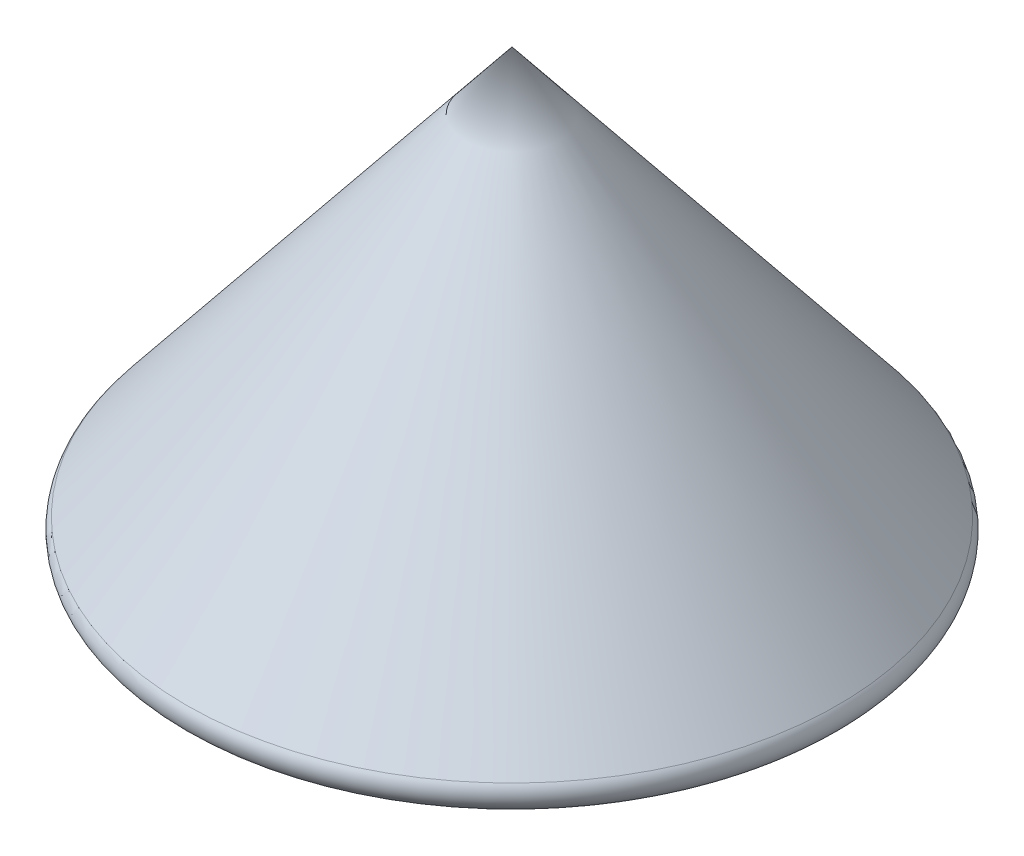
ISO-10303-21;
HEADER;
FILE_DESCRIPTION(('STEP AP214'),'2;1');
FILE_NAME('part.step','',(''),(''),'','','');
FILE_SCHEMA(('AUTOMOTIVE_DESIGN { 1 0 10303 214 1 1 1 1 }'));
ENDSEC;
DATA;
#1=APPLICATION_CONTEXT('core data for automotive mechanical design processes');
#2=APPLICATION_PROTOCOL_DEFINITION('international standard','automotive_design',2000,#1);
#3=PRODUCT_CONTEXT('',#1,'mechanical');
#4=PRODUCT('Part','Part','',(#3));
#5=PRODUCT_RELATED_PRODUCT_CATEGORY('part','',(#4));
#6=PRODUCT_DEFINITION_FORMATION('','',#4);
#7=PRODUCT_DEFINITION_CONTEXT('part definition',#1,'design');
#8=PRODUCT_DEFINITION('design','',#6,#7);
#9=PRODUCT_DEFINITION_SHAPE('','',#8);
#10=(LENGTH_UNIT() NAMED_UNIT(*) SI_UNIT(.MILLI.,.METRE.));
#11=(NAMED_UNIT(*) PLANE_ANGLE_UNIT() SI_UNIT($,.RADIAN.));
#12=(NAMED_UNIT(*) SI_UNIT($,.STERADIAN.) SOLID_ANGLE_UNIT());
#13=UNCERTAINTY_MEASURE_WITH_UNIT(LENGTH_MEASURE(1.E-05),#10,'distance_accuracy_value','');
#14=(GEOMETRIC_REPRESENTATION_CONTEXT(3) GLOBAL_UNCERTAINTY_ASSIGNED_CONTEXT((#13)) GLOBAL_UNIT_ASSIGNED_CONTEXT((#10,
#11,#12)) REPRESENTATION_CONTEXT('',''));
#15=CARTESIAN_POINT('',(0.,0.,0.));
#16=DIRECTION('',(0.,0.,1.));
#17=DIRECTION('',(1.,0.,0.));
#18=AXIS2_PLACEMENT_3D('',#15,#16,#17);
#19=CARTESIAN_POINT('',(0.,0.,0.));
#20=DIRECTION('',(0.,1.,0.));
#21=DIRECTION('',(0.,0.,1.));
#22=AXIS2_PLACEMENT_3D('',#19,#20,#21);
#23=PLANE('',#22);
#24=CARTESIAN_POINT('',(0.,0.,0.));
#25=DIRECTION('',(0.,1.,0.));
#26=DIRECTION('',(0.,0.,1.));
#27=AXIS2_PLACEMENT_3D('',#24,#25,#26);
#28=CIRCLE('',#27,17.9193751525134);
#29=CARTESIAN_POINT('',(0.,0.,17.9193751525134));
#30=VERTEX_POINT('',#29);
#31=EDGE_CURVE('E11',#30,#30,#28,.F.);
#32=ORIENTED_EDGE('',*,*,#31,.T.);
#33=EDGE_LOOP('',(#32));
#34=FACE_BOUND('',#33,.T.);
#35=CARTESIAN_POINT('',(0.,0.,0.));
#36=DIRECTION('',(0.,-1.,0.));
#37=DIRECTION('',(0.,0.,-1.));
#38=AXIS2_PLACEMENT_3D('',#35,#36,#37);
#39=CIRCLE('',#38,2.9);
#40=CARTESIAN_POINT('',(0.,0.,-2.9));
#41=VERTEX_POINT('',#40);
#42=EDGE_CURVE('E67',#41,#41,#39,.T.);
#43=ORIENTED_EDGE('',*,*,#42,.F.);
#44=EDGE_LOOP('',(#43));
#45=FACE_BOUND('',#44,.T.);
#46=ADVANCED_FACE('F33',(#34,#45),#23,.F.);
#47=CARTESIAN_POINT('',(0.,0.,0.));
#48=DIRECTION('',(0.,-1.,0.));
#49=DIRECTION('',(0.,0.,-1.));
#50=AXIS2_PLACEMENT_3D('',#47,#48,#49);
#51=CONICAL_SURFACE('',#50,20.,0.674740942223553);
#52=CARTESIAN_POINT('',(0.,1.62469504755442,0.));
#53=DIRECTION('',(0.,1.,0.));
#54=DIRECTION('',(0.,0.,1.));
#55=AXIS2_PLACEMENT_3D('',#52,#53,#54);
#56=CIRCLE('',#55,18.7002439619565);
#57=CARTESIAN_POINT('',(0.,1.62469504755442,18.7002439619565));
#58=VERTEX_POINT('',#57);
#59=EDGE_CURVE('E40',#58,#58,#56,.T.);
#60=ORIENTED_EDGE('',*,*,#59,.T.);
#61=EDGE_LOOP('',(#60));
#62=FACE_BOUND('',#61,.T.);
#63=CARTESIAN_POINT('',(0.,25.,0.));
#64=VERTEX_POINT('',#63);
#65=VERTEX_LOOP('',#64);
#66=FACE_BOUND('',#65,.T.);
#67=ADVANCED_FACE('F43',(#62,#66),#51,.T.);
#68=CARTESIAN_POINT('',(0.,13.,0.));
#69=DIRECTION('',(0.,-1.,0.));
#70=DIRECTION('',(0.,0.,-1.));
#71=AXIS2_PLACEMENT_3D('',#68,#69,#70);
#72=CYLINDRICAL_SURFACE('',#71,2.9);
#73=CARTESIAN_POINT('',(0.,13.,0.));
#74=DIRECTION('',(0.,-1.,0.));
#75=DIRECTION('',(0.,0.,-1.));
#76=AXIS2_PLACEMENT_3D('',#73,#74,#75);
#77=CIRCLE('',#76,2.9);
#78=CARTESIAN_POINT('',(0.,13.,-2.9));
#79=VERTEX_POINT('',#78);
#80=EDGE_CURVE('E66',#79,#79,#77,.T.);
#81=CARTESIAN_POINT('',(0.,13.,-2.9));
#82=CARTESIAN_POINT('',(0.,12.8645833333333,-2.9));
#83=CARTESIAN_POINT('',(0.,12.7291666666667,-2.9));
#84=CARTESIAN_POINT('',(0.,12.4583333333333,-2.9));
#85=CARTESIAN_POINT('',(0.,12.3229166666667,-2.9));
#86=CARTESIAN_POINT('',(0.,12.0520833333333,-2.9));
#87=CARTESIAN_POINT('',(0.,11.9166666666667,-2.9));
#88=CARTESIAN_POINT('',(0.,11.6458333333333,-2.9));
#89=CARTESIAN_POINT('',(0.,11.5104166666667,-2.9));
#90=CARTESIAN_POINT('',(0.,11.2395833333333,-2.9));
#91=CARTESIAN_POINT('',(0.,11.1041666666667,-2.9));
#92=CARTESIAN_POINT('',(0.,10.8333333333333,-2.9));
#93=CARTESIAN_POINT('',(0.,10.6979166666667,-2.9));
#94=CARTESIAN_POINT('',(0.,10.4270833333333,-2.9));
#95=CARTESIAN_POINT('',(0.,10.2916666666667,-2.9));
#96=CARTESIAN_POINT('',(0.,10.0208333333333,-2.9));
#97=CARTESIAN_POINT('',(0.,9.88541666666667,-2.9));
#98=CARTESIAN_POINT('',(0.,9.61458333333333,-2.9));
#99=CARTESIAN_POINT('',(0.,9.47916666666667,-2.9));
#100=CARTESIAN_POINT('',(0.,9.20833333333333,-2.9));
#101=CARTESIAN_POINT('',(0.,9.07291666666667,-2.9));
#102=CARTESIAN_POINT('',(0.,8.80208333333333,-2.9));
#103=CARTESIAN_POINT('',(0.,8.66666666666667,-2.9));
#104=CARTESIAN_POINT('',(0.,8.39583333333333,-2.9));
#105=CARTESIAN_POINT('',(0.,8.26041666666667,-2.9));
#106=CARTESIAN_POINT('',(0.,7.98958333333333,-2.9));
#107=CARTESIAN_POINT('',(0.,7.85416666666667,-2.9));
#108=CARTESIAN_POINT('',(0.,7.58333333333333,-2.9));
#109=CARTESIAN_POINT('',(0.,7.44791666666667,-2.9));
#110=CARTESIAN_POINT('',(0.,7.17708333333333,-2.9));
#111=CARTESIAN_POINT('',(0.,7.04166666666667,-2.9));
#112=CARTESIAN_POINT('',(0.,6.77083333333333,-2.9));
#113=CARTESIAN_POINT('',(0.,6.63541666666667,-2.9));
#114=CARTESIAN_POINT('',(0.,6.36458333333333,-2.9));
#115=CARTESIAN_POINT('',(0.,6.22916666666667,-2.9));
#116=CARTESIAN_POINT('',(0.,5.95833333333333,-2.9));
#117=CARTESIAN_POINT('',(0.,5.82291666666667,-2.9));
#118=CARTESIAN_POINT('',(0.,5.55208333333333,-2.9));
#119=CARTESIAN_POINT('',(0.,5.41666666666667,-2.9));
#120=CARTESIAN_POINT('',(0.,5.14583333333333,-2.9));
#121=CARTESIAN_POINT('',(0.,5.01041666666667,-2.9));
#122=CARTESIAN_POINT('',(0.,4.73958333333333,-2.9));
#123=CARTESIAN_POINT('',(0.,4.60416666666667,-2.9));
#124=CARTESIAN_POINT('',(0.,4.33333333333333,-2.9));
#125=CARTESIAN_POINT('',(0.,4.19791666666667,-2.9));
#126=CARTESIAN_POINT('',(0.,3.92708333333333,-2.9));
#127=CARTESIAN_POINT('',(0.,3.79166666666667,-2.9));
#128=CARTESIAN_POINT('',(0.,3.52083333333333,-2.9));
#129=CARTESIAN_POINT('',(0.,3.38541666666667,-2.9));
#130=CARTESIAN_POINT('',(0.,3.11458333333333,-2.9));
#131=CARTESIAN_POINT('',(0.,2.97916666666667,-2.9));
#132=CARTESIAN_POINT('',(0.,2.70833333333333,-2.9));
#133=CARTESIAN_POINT('',(0.,2.57291666666667,-2.9));
#134=CARTESIAN_POINT('',(0.,2.30208333333333,-2.9));
#135=CARTESIAN_POINT('',(0.,2.16666666666667,-2.9));
#136=CARTESIAN_POINT('',(0.,1.89583333333333,-2.9));
#137=CARTESIAN_POINT('',(0.,1.76041666666667,-2.9));
#138=CARTESIAN_POINT('',(0.,1.48958333333333,-2.9));
#139=CARTESIAN_POINT('',(0.,1.35416666666667,-2.9));
#140=CARTESIAN_POINT('',(0.,1.08333333333333,-2.9));
#141=CARTESIAN_POINT('',(0.,0.947916666666667,-2.9));
#142=CARTESIAN_POINT('',(0.,0.677083333333334,-2.9));
#143=CARTESIAN_POINT('',(0.,0.541666666666667,-2.9));
#144=CARTESIAN_POINT('',(0.,0.270833333333334,-2.9));
#145=CARTESIAN_POINT('',(0.,0.135416666666667,-2.9));
#146=CARTESIAN_POINT('',(0.,0.,-2.9));
#147=B_SPLINE_CURVE_WITH_KNOTS('',3,(#81,#82,#83,#84,#85,#86,#87,#88,#89,#90,#91,#92,#93,#94,
#95,#96,#97,#98,#99,#100,#101,#102,#103,#104,#105,#106,#107,#108,#109,#110,#111,#112,#113,#114,
#115,#116,#117,#118,#119,#120,#121,#122,#123,#124,#125,#126,#127,#128,#129,#130,#131,#132,#133,
#134,#135,#136,#137,#138,#139,#140,#141,#142,#143,#144,#145,#146),.UNSPECIFIED.,.F.,.F.,(4,2,2,
2,2,2,2,2,2,2,2,2,2,2,2,2,2,2,2,2,2,2,2,2,2,2,2,2,2,2,2,2,4),(0.,0.40625,0.812500000000001,
1.21875,1.625,2.03125,2.4375,2.84375,3.25,3.65625,4.0625,4.46875,4.875,5.28125,5.6875,6.09375,
6.5,6.90625,7.3125,7.71875,8.125,8.53125,8.9375,9.34375,9.75,10.15625,10.5625,10.96875,11.375,
11.78125,12.1875,12.59375,13.),.UNSPECIFIED.);
#148=EDGE_CURVE('BSEAM45',#79,#41,#147,.T.);
#149=ORIENTED_EDGE('',*,*,#80,.F.);
#150=ORIENTED_EDGE('',*,*,#42,.T.);
#151=ORIENTED_EDGE('',*,*,#148,.T.);
#152=ORIENTED_EDGE('',*,*,#148,.F.);
#153=EDGE_LOOP('',(#149,#151,#150,#152));
#154=FACE_BOUND('',#153,.T.);
#155=ADVANCED_FACE('F45',(#154),#72,.F.);
#156=CARTESIAN_POINT('',(0.,13.,0.));
#157=DIRECTION('',(0.,-1.,0.));
#158=DIRECTION('',(0.,0.,-1.));
#159=AXIS2_PLACEMENT_3D('',#156,#157,#158);
#160=PLANE('',#159);
#161=ORIENTED_EDGE('',*,*,#80,.T.);
#162=EDGE_LOOP('',(#161));
#163=FACE_BOUND('',#162,.T.);
#164=ADVANCED_FACE('F52',(#163),#160,.T.);
#165=CARTESIAN_POINT('',(0.,1.,0.));
#166=DIRECTION('',(0.,1.,0.));
#167=DIRECTION('',(0.,0.,1.));
#168=AXIS2_PLACEMENT_3D('',#165,#166,#167);
#169=TOROIDAL_SURFACE('',#168,17.9193751525134,1.);
#170=ORIENTED_EDGE('',*,*,#31,.F.);
#171=EDGE_LOOP('',(#170));
#172=FACE_BOUND('',#171,.T.);
#173=ORIENTED_EDGE('',*,*,#59,.F.);
#174=EDGE_LOOP('',(#173));
#175=FACE_BOUND('',#174,.T.);
#176=ADVANCED_FACE('F35',(#172,#175),#169,.T.);
#177=CLOSED_SHELL('',(#46,#67,#155,#164,#176));
#178=MANIFOLD_SOLID_BREP('B2',#177);
#179=ADVANCED_BREP_SHAPE_REPRESENTATION('',(#18,#178),#14);
#180=SHAPE_DEFINITION_REPRESENTATION(#9,#179);
ENDSEC;
END-ISO-10303-21;
